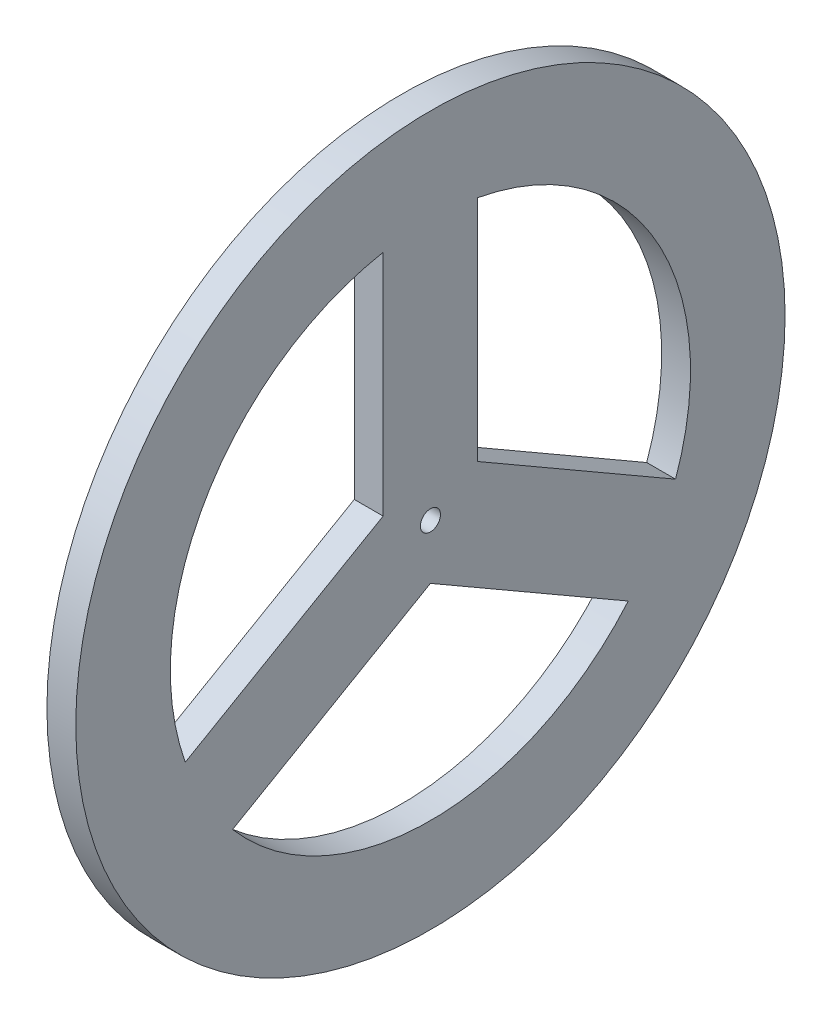
ISO-10303-21;
HEADER;
FILE_DESCRIPTION(('STEP AP214'),'2;1');
FILE_NAME('part.step','',(''),(''),'','','');
FILE_SCHEMA(('AUTOMOTIVE_DESIGN { 1 0 10303 214 1 1 1 1 }'));
ENDSEC;
DATA;
#1=APPLICATION_CONTEXT('core data for automotive mechanical design processes');
#2=APPLICATION_PROTOCOL_DEFINITION('international standard','automotive_design',2000,#1);
#3=PRODUCT_CONTEXT('',#1,'mechanical');
#4=PRODUCT('Part','Part','',(#3));
#5=PRODUCT_RELATED_PRODUCT_CATEGORY('part','',(#4));
#6=PRODUCT_DEFINITION_FORMATION('','',#4);
#7=PRODUCT_DEFINITION_CONTEXT('part definition',#1,'design');
#8=PRODUCT_DEFINITION('design','',#6,#7);
#9=PRODUCT_DEFINITION_SHAPE('','',#8);
#10=(LENGTH_UNIT() NAMED_UNIT(*) SI_UNIT(.MILLI.,.METRE.));
#11=(NAMED_UNIT(*) PLANE_ANGLE_UNIT() SI_UNIT($,.RADIAN.));
#12=(NAMED_UNIT(*) SI_UNIT($,.STERADIAN.) SOLID_ANGLE_UNIT());
#13=UNCERTAINTY_MEASURE_WITH_UNIT(LENGTH_MEASURE(1.E-05),#10,'distance_accuracy_value','');
#14=(GEOMETRIC_REPRESENTATION_CONTEXT(3) GLOBAL_UNCERTAINTY_ASSIGNED_CONTEXT((#13)) GLOBAL_UNIT_ASSIGNED_CONTEXT((#10,
#11,#12)) REPRESENTATION_CONTEXT('',''));
#15=CARTESIAN_POINT('',(0.,0.,0.));
#16=DIRECTION('',(0.,0.,1.));
#17=DIRECTION('',(1.,0.,0.));
#18=AXIS2_PLACEMENT_3D('',#15,#16,#17);
#19=CARTESIAN_POINT('',(3.0988,0.,0.));
#20=DIRECTION('',(1.,0.,0.));
#21=DIRECTION('',(0.,0.,-1.));
#22=AXIS2_PLACEMENT_3D('',#19,#20,#21);
#23=PLANE('',#22);
#24=DIRECTION('',(0.,-1.,0.));
#25=VECTOR('',#24,1.);
#26=CARTESIAN_POINT('',(3.0988,0.,5.07999999999999));
#27=LINE('',#26,#25);
#28=CARTESIAN_POINT('',(3.0988,27.4743007190356,5.08));
#29=VERTEX_POINT('',#28);
#30=CARTESIAN_POINT('',(3.0988,2.93293936748331,5.08));
#31=VERTEX_POINT('',#30);
#32=EDGE_CURVE('E153',#29,#31,#27,.T.);
#33=ORIENTED_EDGE('',*,*,#32,.T.);
#34=DIRECTION('',(0.,-0.499999999999998,0.86602540378444));
#35=VECTOR('',#34,1.);
#36=CARTESIAN_POINT('',(3.0988,4.39940905122495,2.53999999999999));
#37=LINE('',#36,#35);
#38=CARTESIAN_POINT('',(3.0988,-9.3377413082928,26.3334423738979));
#39=VERTEX_POINT('',#38);
#40=EDGE_CURVE('E161',#31,#39,#37,.T.);
#41=ORIENTED_EDGE('',*,*,#40,.T.);
#42=CARTESIAN_POINT('',(3.0988,0.,0.));
#43=DIRECTION('',(1.,0.,0.));
#44=DIRECTION('',(0.,0.,-1.));
#45=AXIS2_PLACEMENT_3D('',#42,#43,#44);
#46=CIRCLE('',#45,27.94);
#47=EDGE_CURVE('E144',#29,#39,#46,.T.);
#48=ORIENTED_EDGE('',*,*,#47,.F.);
#49=EDGE_LOOP('',(#33,#41,#48));
#50=FACE_BOUND('',#49,.T.);
#51=CARTESIAN_POINT('',(3.0988,0.,0.));
#52=DIRECTION('',(1.,0.,0.));
#53=DIRECTION('',(0.,0.,-1.));
#54=AXIS2_PLACEMENT_3D('',#51,#52,#53);
#55=CIRCLE('',#54,27.94);
#56=CARTESIAN_POINT('',(3.0988,-18.1365594107427,21.2534423738979));
#57=VERTEX_POINT('',#56);
#58=CARTESIAN_POINT('',(3.0988,-18.1365594107427,-21.2534423738979));
#59=VERTEX_POINT('',#58);
#60=EDGE_CURVE('E197',#57,#59,#55,.T.);
#61=ORIENTED_EDGE('',*,*,#60,.F.);
#62=DIRECTION('',(0.,-0.499999999999998,0.86602540378444));
#63=VECTOR('',#62,1.);
#64=CARTESIAN_POINT('',(3.0988,-4.39940905122495,-2.53999999999999));
#65=LINE('',#64,#63);
#66=CARTESIAN_POINT('',(3.0988,-5.86587873496659,0.));
#67=VERTEX_POINT('',#66);
#68=EDGE_CURVE('E195',#67,#57,#65,.T.);
#69=ORIENTED_EDGE('',*,*,#68,.F.);
#70=DIRECTION('',(0.,-0.499999999999998,-0.86602540378444));
#71=VECTOR('',#70,1.);
#72=CARTESIAN_POINT('',(3.0988,-4.39940905122496,2.53999999999999));
#73=LINE('',#72,#71);
#74=EDGE_CURVE('E201',#67,#59,#73,.T.);
#75=ORIENTED_EDGE('',*,*,#74,.T.);
#76=EDGE_LOOP('',(#61,#69,#75));
#77=FACE_BOUND('',#76,.T.);
#78=CARTESIAN_POINT('',(3.0988,0.,0.));
#79=DIRECTION('',(1.,0.,0.));
#80=DIRECTION('',(0.,0.,-1.));
#81=AXIS2_PLACEMENT_3D('',#78,#79,#80);
#82=CIRCLE('',#81,38.1);
#83=CARTESIAN_POINT('',(3.0988,0.,-38.1));
#84=VERTEX_POINT('',#83);
#85=EDGE_CURVE('E12',#84,#84,#82,.T.);
#86=ORIENTED_EDGE('',*,*,#85,.T.);
#87=EDGE_LOOP('',(#86));
#88=FACE_BOUND('',#87,.T.);
#89=CARTESIAN_POINT('',(3.0988,0.,0.));
#90=DIRECTION('',(1.,0.,0.));
#91=DIRECTION('',(0.,0.,-1.));
#92=AXIS2_PLACEMENT_3D('',#89,#90,#91);
#93=CIRCLE('',#92,1.0795);
#94=CARTESIAN_POINT('',(3.0988,0.,-1.0795));
#95=VERTEX_POINT('',#94);
#96=EDGE_CURVE('E185',#95,#95,#93,.T.);
#97=ORIENTED_EDGE('',*,*,#96,.F.);
#98=EDGE_LOOP('',(#97));
#99=FACE_BOUND('',#98,.T.);
#100=CARTESIAN_POINT('',(3.0988,0.,0.));
#101=DIRECTION('',(1.,0.,0.));
#102=DIRECTION('',(0.,0.,-1.));
#103=AXIS2_PLACEMENT_3D('',#100,#101,#102);
#104=CIRCLE('',#103,27.94);
#105=CARTESIAN_POINT('',(3.0988,-9.33774130829278,-26.3334423738979));
#106=VERTEX_POINT('',#105);
#107=CARTESIAN_POINT('',(3.0988,27.4743007190356,-5.08));
#108=VERTEX_POINT('',#107);
#109=EDGE_CURVE('E175',#106,#108,#104,.T.);
#110=ORIENTED_EDGE('',*,*,#109,.F.);
#111=DIRECTION('',(0.,-0.499999999999998,-0.86602540378444));
#112=VECTOR('',#111,1.);
#113=CARTESIAN_POINT('',(3.0988,4.39940905122496,-2.53999999999999));
#114=LINE('',#113,#112);
#115=CARTESIAN_POINT('',(3.0988,2.93293936748331,-5.08));
#116=VERTEX_POINT('',#115);
#117=EDGE_CURVE('E173',#116,#106,#114,.T.);
#118=ORIENTED_EDGE('',*,*,#117,.F.);
#119=DIRECTION('',(0.,-1.,0.));
#120=VECTOR('',#119,1.);
#121=CARTESIAN_POINT('',(3.0988,0.,-5.08000000000001));
#122=LINE('',#121,#120);
#123=EDGE_CURVE('E178',#108,#116,#122,.T.);
#124=ORIENTED_EDGE('',*,*,#123,.F.);
#125=EDGE_LOOP('',(#110,#118,#124));
#126=FACE_BOUND('',#125,.T.);
#127=ADVANCED_FACE('F69',(#50,#77,#88,#99,#126),#23,.T.);
#128=CARTESIAN_POINT('',(0.,0.,0.));
#129=DIRECTION('',(1.,0.,0.));
#130=DIRECTION('',(0.,0.,-1.));
#131=AXIS2_PLACEMENT_3D('',#128,#129,#130);
#132=PLANE('',#131);
#133=DIRECTION('',(0.,-0.499999999999998,0.86602540378444));
#134=VECTOR('',#133,1.);
#135=CARTESIAN_POINT('',(0.,4.39940905122495,2.53999999999999));
#136=LINE('',#135,#134);
#137=CARTESIAN_POINT('',(0.,2.93293936748331,5.08));
#138=VERTEX_POINT('',#137);
#139=CARTESIAN_POINT('',(0.,-9.3377413082928,26.3334423738979));
#140=VERTEX_POINT('',#139);
#141=EDGE_CURVE('E158',#138,#140,#136,.T.);
#142=ORIENTED_EDGE('',*,*,#141,.F.);
#143=DIRECTION('',(0.,-1.,0.));
#144=VECTOR('',#143,1.);
#145=CARTESIAN_POINT('',(0.,0.,5.07999999999999));
#146=LINE('',#145,#144);
#147=CARTESIAN_POINT('',(0.,27.4743007190356,5.08));
#148=VERTEX_POINT('',#147);
#149=EDGE_CURVE('E166',#148,#138,#146,.T.);
#150=ORIENTED_EDGE('',*,*,#149,.F.);
#151=CARTESIAN_POINT('',(0.,0.,0.));
#152=DIRECTION('',(1.,0.,0.));
#153=DIRECTION('',(0.,0.,-1.));
#154=AXIS2_PLACEMENT_3D('',#151,#152,#153);
#155=CIRCLE('',#154,27.94);
#156=EDGE_CURVE('E147',#148,#140,#155,.T.);
#157=ORIENTED_EDGE('',*,*,#156,.T.);
#158=EDGE_LOOP('',(#142,#150,#157));
#159=FACE_BOUND('',#158,.T.);
#160=CARTESIAN_POINT('',(0.,0.,0.));
#161=DIRECTION('',(1.,0.,0.));
#162=DIRECTION('',(0.,0.,-1.));
#163=AXIS2_PLACEMENT_3D('',#160,#161,#162);
#164=CIRCLE('',#163,1.0795);
#165=CARTESIAN_POINT('',(0.,0.,-1.0795));
#166=VERTEX_POINT('',#165);
#167=EDGE_CURVE('E278',#166,#166,#164,.T.);
#168=ORIENTED_EDGE('',*,*,#167,.T.);
#169=EDGE_LOOP('',(#168));
#170=FACE_BOUND('',#169,.T.);
#171=DIRECTION('',(0.,-0.499999999999998,0.86602540378444));
#172=VECTOR('',#171,1.);
#173=CARTESIAN_POINT('',(0.,-4.39940905122495,-2.53999999999999));
#174=LINE('',#173,#172);
#175=CARTESIAN_POINT('',(0.,-5.86587873496659,0.));
#176=VERTEX_POINT('',#175);
#177=CARTESIAN_POINT('',(0.,-18.1365594107427,21.2534423738979));
#178=VERTEX_POINT('',#177);
#179=EDGE_CURVE('E150',#176,#178,#174,.T.);
#180=ORIENTED_EDGE('',*,*,#179,.T.);
#181=CARTESIAN_POINT('',(0.,0.,0.));
#182=DIRECTION('',(1.,0.,0.));
#183=DIRECTION('',(0.,0.,-1.));
#184=AXIS2_PLACEMENT_3D('',#181,#182,#183);
#185=CIRCLE('',#184,27.94);
#186=CARTESIAN_POINT('',(0.,-18.1365594107427,-21.2534423738979));
#187=VERTEX_POINT('',#186);
#188=EDGE_CURVE('E207',#178,#187,#185,.T.);
#189=ORIENTED_EDGE('',*,*,#188,.T.);
#190=DIRECTION('',(0.,-0.499999999999998,-0.86602540378444));
#191=VECTOR('',#190,1.);
#192=CARTESIAN_POINT('',(0.,-4.39940905122496,2.53999999999999));
#193=LINE('',#192,#191);
#194=EDGE_CURVE('E198',#176,#187,#193,.T.);
#195=ORIENTED_EDGE('',*,*,#194,.F.);
#196=EDGE_LOOP('',(#180,#189,#195));
#197=FACE_BOUND('',#196,.T.);
#198=CARTESIAN_POINT('',(0.,0.,0.));
#199=DIRECTION('',(1.,0.,0.));
#200=DIRECTION('',(0.,0.,-1.));
#201=AXIS2_PLACEMENT_3D('',#198,#199,#200);
#202=CIRCLE('',#201,38.1);
#203=CARTESIAN_POINT('',(0.,0.,-38.1));
#204=VERTEX_POINT('',#203);
#205=EDGE_CURVE('E73',#204,#204,#202,.T.);
#206=ORIENTED_EDGE('',*,*,#205,.F.);
#207=EDGE_LOOP('',(#206));
#208=FACE_BOUND('',#207,.T.);
#209=DIRECTION('',(0.,-0.499999999999998,-0.86602540378444));
#210=VECTOR('',#209,1.);
#211=CARTESIAN_POINT('',(0.,4.39940905122496,-2.53999999999999));
#212=LINE('',#211,#210);
#213=CARTESIAN_POINT('',(0.,2.93293936748331,-5.08000000000001));
#214=VERTEX_POINT('',#213);
#215=CARTESIAN_POINT('',(0.,-9.33774130829278,-26.3334423738979));
#216=VERTEX_POINT('',#215);
#217=EDGE_CURVE('E181',#214,#216,#212,.T.);
#218=ORIENTED_EDGE('',*,*,#217,.T.);
#219=CARTESIAN_POINT('',(0.,0.,0.));
#220=DIRECTION('',(1.,0.,0.));
#221=DIRECTION('',(0.,0.,-1.));
#222=AXIS2_PLACEMENT_3D('',#219,#220,#221);
#223=CIRCLE('',#222,27.94);
#224=CARTESIAN_POINT('',(0.,27.4743007190356,-5.08));
#225=VERTEX_POINT('',#224);
#226=EDGE_CURVE('E184',#216,#225,#223,.T.);
#227=ORIENTED_EDGE('',*,*,#226,.T.);
#228=DIRECTION('',(0.,-1.,0.));
#229=VECTOR('',#228,1.);
#230=CARTESIAN_POINT('',(0.,0.,-5.08000000000001));
#231=LINE('',#230,#229);
#232=EDGE_CURVE('E176',#225,#214,#231,.T.);
#233=ORIENTED_EDGE('',*,*,#232,.T.);
#234=EDGE_LOOP('',(#218,#227,#233));
#235=FACE_BOUND('',#234,.T.);
#236=ADVANCED_FACE('F224',(#159,#170,#197,#208,#235),#132,.F.);
#237=CARTESIAN_POINT('',(3.0988,0.,0.));
#238=DIRECTION('',(-1.,0.,0.));
#239=DIRECTION('',(0.,0.,1.));
#240=AXIS2_PLACEMENT_3D('',#237,#238,#239);
#241=CYLINDRICAL_SURFACE('',#240,38.1);
#242=ORIENTED_EDGE('',*,*,#85,.F.);
#243=EDGE_LOOP('',(#242));
#244=FACE_BOUND('',#243,.T.);
#245=ORIENTED_EDGE('',*,*,#205,.T.);
#246=EDGE_LOOP('',(#245));
#247=FACE_BOUND('',#246,.T.);
#248=ADVANCED_FACE('F71',(#244,#247),#241,.T.);
#249=CARTESIAN_POINT('',(3.0988,-4.39940905122495,-2.53999999999999));
#250=DIRECTION('',(0.,-0.86602540378444,-0.499999999999998));
#251=DIRECTION('',(0.,0.499999999999998,-0.86602540378444));
#252=AXIS2_PLACEMENT_3D('',#249,#250,#251);
#253=PLANE('',#252);
#254=ORIENTED_EDGE('',*,*,#179,.F.);
#255=DIRECTION('',(-1.,0.,0.));
#256=VECTOR('',#255,1.);
#257=CARTESIAN_POINT('',(3.0988,-5.86587873496659,0.));
#258=LINE('',#257,#256);
#259=EDGE_CURVE('E204',#67,#176,#258,.T.);
#260=ORIENTED_EDGE('',*,*,#259,.F.);
#261=ORIENTED_EDGE('',*,*,#68,.T.);
#262=DIRECTION('',(-1.,0.,0.));
#263=VECTOR('',#262,1.);
#264=CARTESIAN_POINT('',(3.0988,-18.1365594107427,21.2534423738979));
#265=LINE('',#264,#263);
#266=EDGE_CURVE('E216',#57,#178,#265,.T.);
#267=ORIENTED_EDGE('',*,*,#266,.T.);
#268=EDGE_LOOP('',(#254,#260,#261,#267));
#269=FACE_BOUND('',#268,.T.);
#270=ADVANCED_FACE('F253',(#269),#253,.T.);
#271=CARTESIAN_POINT('',(3.0988,0.,0.));
#272=DIRECTION('',(-1.,0.,0.));
#273=DIRECTION('',(0.,0.,1.));
#274=AXIS2_PLACEMENT_3D('',#271,#272,#273);
#275=CYLINDRICAL_SURFACE('',#274,27.94);
#276=ORIENTED_EDGE('',*,*,#188,.F.);
#277=ORIENTED_EDGE('',*,*,#266,.F.);
#278=ORIENTED_EDGE('',*,*,#60,.T.);
#279=DIRECTION('',(-1.,0.,0.));
#280=VECTOR('',#279,1.);
#281=CARTESIAN_POINT('',(3.0988,-18.1365594107427,-21.2534423738979));
#282=LINE('',#281,#280);
#283=EDGE_CURVE('E214',#59,#187,#282,.T.);
#284=ORIENTED_EDGE('',*,*,#283,.T.);
#285=EDGE_LOOP('',(#276,#277,#278,#284));
#286=FACE_BOUND('',#285,.T.);
#287=ADVANCED_FACE('F256',(#286),#275,.F.);
#288=CARTESIAN_POINT('',(3.0988,-4.39940905122496,2.53999999999999));
#289=DIRECTION('',(0.,0.86602540378444,-0.499999999999998));
#290=DIRECTION('',(0.,0.499999999999998,0.86602540378444));
#291=AXIS2_PLACEMENT_3D('',#288,#289,#290);
#292=PLANE('',#291);
#293=ORIENTED_EDGE('',*,*,#194,.T.);
#294=ORIENTED_EDGE('',*,*,#283,.F.);
#295=ORIENTED_EDGE('',*,*,#74,.F.);
#296=ORIENTED_EDGE('',*,*,#259,.T.);
#297=EDGE_LOOP('',(#293,#294,#295,#296));
#298=FACE_BOUND('',#297,.T.);
#299=ADVANCED_FACE('F259',(#298),#292,.F.);
#300=CARTESIAN_POINT('',(3.0988,0.,0.));
#301=DIRECTION('',(-1.,0.,0.));
#302=DIRECTION('',(0.,0.,1.));
#303=AXIS2_PLACEMENT_3D('',#300,#301,#302);
#304=CYLINDRICAL_SURFACE('',#303,1.0795);
#305=ORIENTED_EDGE('',*,*,#96,.T.);
#306=EDGE_LOOP('',(#305));
#307=FACE_BOUND('',#306,.T.);
#308=ORIENTED_EDGE('',*,*,#167,.F.);
#309=EDGE_LOOP('',(#308));
#310=FACE_BOUND('',#309,.T.);
#311=ADVANCED_FACE('F246',(#307,#310),#304,.F.);
#312=CARTESIAN_POINT('',(3.0988,4.39940905122496,-2.53999999999999));
#313=DIRECTION('',(0.,0.86602540378444,-0.499999999999998));
#314=DIRECTION('',(0.,0.499999999999998,0.86602540378444));
#315=AXIS2_PLACEMENT_3D('',#312,#313,#314);
#316=PLANE('',#315);
#317=ORIENTED_EDGE('',*,*,#217,.F.);
#318=DIRECTION('',(-1.,0.,0.));
#319=VECTOR('',#318,1.);
#320=CARTESIAN_POINT('',(3.0988,2.93293936748331,-5.08));
#321=LINE('',#320,#319);
#322=EDGE_CURVE('E180',#116,#214,#321,.T.);
#323=ORIENTED_EDGE('',*,*,#322,.F.);
#324=ORIENTED_EDGE('',*,*,#117,.T.);
#325=DIRECTION('',(-1.,0.,0.));
#326=VECTOR('',#325,1.);
#327=CARTESIAN_POINT('',(3.0988,-9.33774130829278,-26.3334423738979));
#328=LINE('',#327,#326);
#329=EDGE_CURVE('E168',#106,#216,#328,.T.);
#330=ORIENTED_EDGE('',*,*,#329,.T.);
#331=EDGE_LOOP('',(#317,#323,#324,#330));
#332=FACE_BOUND('',#331,.T.);
#333=ADVANCED_FACE('F230',(#332),#316,.T.);
#334=CARTESIAN_POINT('',(3.0988,0.,0.));
#335=DIRECTION('',(-1.,0.,0.));
#336=DIRECTION('',(0.,0.,1.));
#337=AXIS2_PLACEMENT_3D('',#334,#335,#336);
#338=CYLINDRICAL_SURFACE('',#337,27.94);
#339=ORIENTED_EDGE('',*,*,#226,.F.);
#340=ORIENTED_EDGE('',*,*,#329,.F.);
#341=ORIENTED_EDGE('',*,*,#109,.T.);
#342=DIRECTION('',(-1.,0.,0.));
#343=VECTOR('',#342,1.);
#344=CARTESIAN_POINT('',(3.0988,27.4743007190356,-5.08));
#345=LINE('',#344,#343);
#346=EDGE_CURVE('E92',#108,#225,#345,.T.);
#347=ORIENTED_EDGE('',*,*,#346,.T.);
#348=EDGE_LOOP('',(#339,#340,#341,#347));
#349=FACE_BOUND('',#348,.T.);
#350=ADVANCED_FACE('F238',(#349),#338,.F.);
#351=CARTESIAN_POINT('',(3.0988,0.,-5.08000000000001));
#352=DIRECTION('',(0.,0.,-1.));
#353=DIRECTION('',(0.,1.,0.));
#354=AXIS2_PLACEMENT_3D('',#351,#352,#353);
#355=PLANE('',#354);
#356=ORIENTED_EDGE('',*,*,#232,.F.);
#357=ORIENTED_EDGE('',*,*,#346,.F.);
#358=ORIENTED_EDGE('',*,*,#123,.T.);
#359=ORIENTED_EDGE('',*,*,#322,.T.);
#360=EDGE_LOOP('',(#356,#357,#358,#359));
#361=FACE_BOUND('',#360,.T.);
#362=ADVANCED_FACE('F233',(#361),#355,.T.);
#363=CARTESIAN_POINT('',(3.0988,0.,5.07999999999999));
#364=DIRECTION('',(0.,0.,-1.));
#365=DIRECTION('',(0.,1.,0.));
#366=AXIS2_PLACEMENT_3D('',#363,#364,#365);
#367=PLANE('',#366);
#368=ORIENTED_EDGE('',*,*,#149,.T.);
#369=DIRECTION('',(-1.,0.,0.));
#370=VECTOR('',#369,1.);
#371=CARTESIAN_POINT('',(3.0988,2.93293936748331,5.08));
#372=LINE('',#371,#370);
#373=EDGE_CURVE('E156',#31,#138,#372,.T.);
#374=ORIENTED_EDGE('',*,*,#373,.F.);
#375=ORIENTED_EDGE('',*,*,#32,.F.);
#376=DIRECTION('',(-1.,0.,0.));
#377=VECTOR('',#376,1.);
#378=CARTESIAN_POINT('',(3.0988,27.4743007190356,5.08));
#379=LINE('',#378,#377);
#380=EDGE_CURVE('E140',#29,#148,#379,.T.);
#381=ORIENTED_EDGE('',*,*,#380,.T.);
#382=EDGE_LOOP('',(#368,#374,#375,#381));
#383=FACE_BOUND('',#382,.T.);
#384=ADVANCED_FACE('F154',(#383),#367,.F.);
#385=CARTESIAN_POINT('',(3.0988,0.,0.));
#386=DIRECTION('',(-1.,0.,0.));
#387=DIRECTION('',(0.,0.,1.));
#388=AXIS2_PLACEMENT_3D('',#385,#386,#387);
#389=CYLINDRICAL_SURFACE('',#388,27.94);
#390=ORIENTED_EDGE('',*,*,#156,.F.);
#391=ORIENTED_EDGE('',*,*,#380,.F.);
#392=ORIENTED_EDGE('',*,*,#47,.T.);
#393=DIRECTION('',(-1.,0.,0.));
#394=VECTOR('',#393,1.);
#395=CARTESIAN_POINT('',(3.0988,-9.3377413082928,26.3334423738979));
#396=LINE('',#395,#394);
#397=EDGE_CURVE('E84',#39,#140,#396,.T.);
#398=ORIENTED_EDGE('',*,*,#397,.T.);
#399=EDGE_LOOP('',(#390,#391,#392,#398));
#400=FACE_BOUND('',#399,.T.);
#401=ADVANCED_FACE('F142',(#400),#389,.F.);
#402=CARTESIAN_POINT('',(3.0988,4.39940905122495,2.53999999999999));
#403=DIRECTION('',(0.,-0.86602540378444,-0.499999999999998));
#404=DIRECTION('',(0.,0.499999999999998,-0.86602540378444));
#405=AXIS2_PLACEMENT_3D('',#402,#403,#404);
#406=PLANE('',#405);
#407=ORIENTED_EDGE('',*,*,#141,.T.);
#408=ORIENTED_EDGE('',*,*,#397,.F.);
#409=ORIENTED_EDGE('',*,*,#40,.F.);
#410=ORIENTED_EDGE('',*,*,#373,.T.);
#411=EDGE_LOOP('',(#407,#408,#409,#410));
#412=FACE_BOUND('',#411,.T.);
#413=ADVANCED_FACE('F341',(#412),#406,.F.);
#414=CLOSED_SHELL('',(#127,#236,#248,#270,#287,#299,#311,#333,#350,#362,#384,#401,#413));
#415=MANIFOLD_SOLID_BREP('B2',#414);
#416=ADVANCED_BREP_SHAPE_REPRESENTATION('',(#18,#415),#14);
#417=SHAPE_DEFINITION_REPRESENTATION(#9,#416);
ENDSEC;
END-ISO-10303-21;
